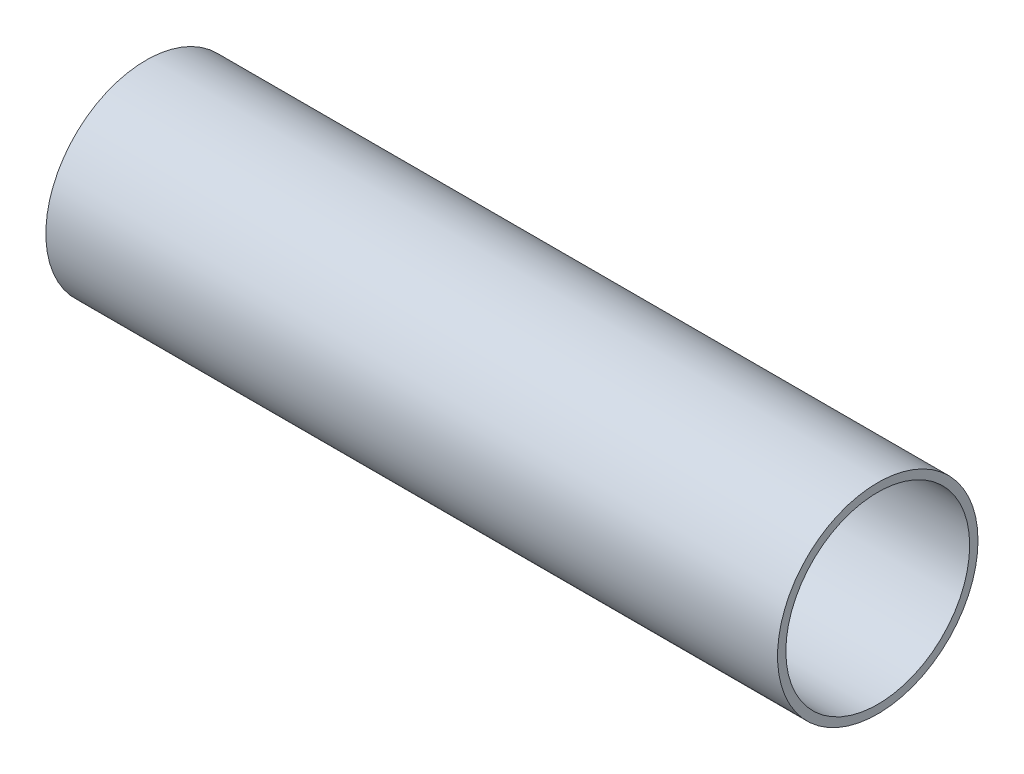
ISO-10303-21;
HEADER;
FILE_DESCRIPTION(('STEP AP214'),'2;1');
FILE_NAME('part.step','',(''),(''),'','','');
FILE_SCHEMA(('AUTOMOTIVE_DESIGN { 1 0 10303 214 1 1 1 1 }'));
ENDSEC;
DATA;
#1=APPLICATION_CONTEXT('core data for automotive mechanical design processes');
#2=APPLICATION_PROTOCOL_DEFINITION('international standard','automotive_design',2000,#1);
#3=PRODUCT_CONTEXT('',#1,'mechanical');
#4=PRODUCT('Part','Part','',(#3));
#5=PRODUCT_RELATED_PRODUCT_CATEGORY('part','',(#4));
#6=PRODUCT_DEFINITION_FORMATION('','',#4);
#7=PRODUCT_DEFINITION_CONTEXT('part definition',#1,'design');
#8=PRODUCT_DEFINITION('design','',#6,#7);
#9=PRODUCT_DEFINITION_SHAPE('','',#8);
#10=(LENGTH_UNIT() NAMED_UNIT(*) SI_UNIT(.MILLI.,.METRE.));
#11=(NAMED_UNIT(*) PLANE_ANGLE_UNIT() SI_UNIT($,.RADIAN.));
#12=(NAMED_UNIT(*) SI_UNIT($,.STERADIAN.) SOLID_ANGLE_UNIT());
#13=UNCERTAINTY_MEASURE_WITH_UNIT(LENGTH_MEASURE(1.E-05),#10,'distance_accuracy_value','');
#14=(GEOMETRIC_REPRESENTATION_CONTEXT(3) GLOBAL_UNCERTAINTY_ASSIGNED_CONTEXT((#13)) GLOBAL_UNIT_ASSIGNED_CONTEXT((#10,
#11,#12)) REPRESENTATION_CONTEXT('',''));
#15=CARTESIAN_POINT('',(0.,0.,0.));
#16=DIRECTION('',(0.,0.,1.));
#17=DIRECTION('',(1.,0.,0.));
#18=AXIS2_PLACEMENT_3D('',#15,#16,#17);
#19=CARTESIAN_POINT('',(0.,0.,0.));
#20=DIRECTION('',(1.,0.,0.));
#21=DIRECTION('',(0.,0.,-1.));
#22=AXIS2_PLACEMENT_3D('',#19,#20,#21);
#23=CYLINDRICAL_SURFACE('',#22,15.45);
#24=CARTESIAN_POINT('',(0.,0.,0.));
#25=DIRECTION('',(1.,0.,0.));
#26=DIRECTION('',(0.,0.,-1.));
#27=AXIS2_PLACEMENT_3D('',#24,#25,#26);
#28=CIRCLE('',#27,15.45);
#29=CARTESIAN_POINT('',(0.,0.,-15.45));
#30=VERTEX_POINT('',#29);
#31=EDGE_CURVE('E27',#30,#30,#28,.T.);
#32=ORIENTED_EDGE('',*,*,#31,.F.);
#33=EDGE_LOOP('',(#32));
#34=FACE_BOUND('',#33,.T.);
#35=CARTESIAN_POINT('',(122.99449312,0.,0.));
#36=DIRECTION('',(1.,0.,0.));
#37=DIRECTION('',(0.,0.,-1.));
#38=AXIS2_PLACEMENT_3D('',#35,#36,#37);
#39=CIRCLE('',#38,15.45);
#40=CARTESIAN_POINT('',(122.99449312,0.,-15.45));
#41=VERTEX_POINT('',#40);
#42=EDGE_CURVE('E18',#41,#41,#39,.T.);
#43=ORIENTED_EDGE('',*,*,#42,.T.);
#44=EDGE_LOOP('',(#43));
#45=FACE_BOUND('',#44,.T.);
#46=ADVANCED_FACE('F15',(#34,#45),#23,.F.);
#47=CARTESIAN_POINT('',(122.99449312,0.,0.));
#48=DIRECTION('',(-1.,0.,0.));
#49=DIRECTION('',(0.,0.,1.));
#50=AXIS2_PLACEMENT_3D('',#47,#48,#49);
#51=PLANE('',#50);
#52=ORIENTED_EDGE('',*,*,#42,.F.);
#53=EDGE_LOOP('',(#52));
#54=FACE_BOUND('',#53,.T.);
#55=CARTESIAN_POINT('',(122.99449312,0.,0.));
#56=DIRECTION('',(1.,0.,0.));
#57=DIRECTION('',(0.,0.,-1.));
#58=AXIS2_PLACEMENT_3D('',#55,#56,#57);
#59=CIRCLE('',#58,16.85);
#60=CARTESIAN_POINT('',(122.99449312,0.,-16.85));
#61=VERTEX_POINT('',#60);
#62=EDGE_CURVE('E22',#61,#61,#59,.F.);
#63=ORIENTED_EDGE('',*,*,#62,.F.);
#64=EDGE_LOOP('',(#63));
#65=FACE_BOUND('',#64,.T.);
#66=ADVANCED_FACE('F36',(#54,#65),#51,.F.);
#67=CARTESIAN_POINT('',(0.,0.,0.));
#68=DIRECTION('',(-1.,0.,0.));
#69=DIRECTION('',(0.,0.,1.));
#70=AXIS2_PLACEMENT_3D('',#67,#68,#69);
#71=PLANE('',#70);
#72=ORIENTED_EDGE('',*,*,#31,.T.);
#73=EDGE_LOOP('',(#72));
#74=FACE_BOUND('',#73,.T.);
#75=CARTESIAN_POINT('',(0.,0.,0.));
#76=DIRECTION('',(1.,0.,0.));
#77=DIRECTION('',(0.,0.,-1.));
#78=AXIS2_PLACEMENT_3D('',#75,#76,#77);
#79=CIRCLE('',#78,16.85);
#80=CARTESIAN_POINT('',(0.,0.,-16.85));
#81=VERTEX_POINT('',#80);
#82=EDGE_CURVE('E10',#81,#81,#79,.T.);
#83=ORIENTED_EDGE('',*,*,#82,.F.);
#84=EDGE_LOOP('',(#83));
#85=FACE_BOUND('',#84,.T.);
#86=ADVANCED_FACE('F39',(#74,#85),#71,.T.);
#87=CARTESIAN_POINT('',(0.,0.,0.));
#88=DIRECTION('',(1.,0.,0.));
#89=DIRECTION('',(0.,0.,-1.));
#90=AXIS2_PLACEMENT_3D('',#87,#88,#89);
#91=CYLINDRICAL_SURFACE('',#90,16.85);
#92=ORIENTED_EDGE('',*,*,#82,.T.);
#93=EDGE_LOOP('',(#92));
#94=FACE_BOUND('',#93,.T.);
#95=ORIENTED_EDGE('',*,*,#62,.T.);
#96=EDGE_LOOP('',(#95));
#97=FACE_BOUND('',#96,.T.);
#98=ADVANCED_FACE('F42',(#94,#97),#91,.T.);
#99=CLOSED_SHELL('',(#46,#66,#86,#98));
#100=MANIFOLD_SOLID_BREP('B1',#99);
#101=ADVANCED_BREP_SHAPE_REPRESENTATION('',(#18,#100),#14);
#102=SHAPE_DEFINITION_REPRESENTATION(#9,#101);
ENDSEC;
END-ISO-10303-21;
